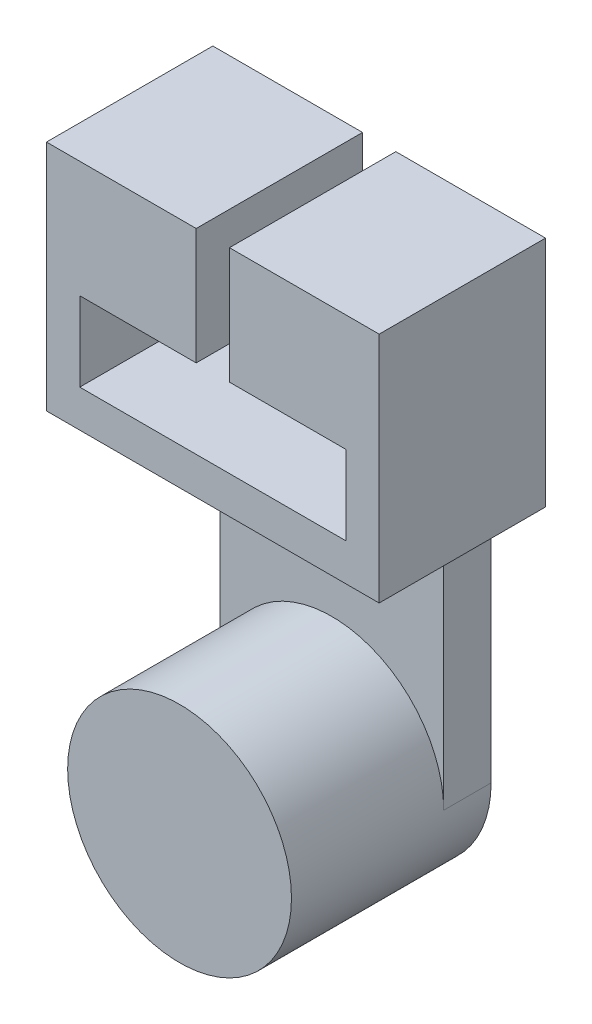
ISO-10303-21;
HEADER;
FILE_DESCRIPTION(('STEP AP214'),'2;1');
FILE_NAME('part.step','',(''),(''),'','','');
FILE_SCHEMA(('AUTOMOTIVE_DESIGN { 1 0 10303 214 1 1 1 1 }'));
ENDSEC;
DATA;
#1=APPLICATION_CONTEXT('core data for automotive mechanical design processes');
#2=APPLICATION_PROTOCOL_DEFINITION('international standard','automotive_design',2000,#1);
#3=PRODUCT_CONTEXT('',#1,'mechanical');
#4=PRODUCT('Part','Part','',(#3));
#5=PRODUCT_RELATED_PRODUCT_CATEGORY('part','',(#4));
#6=PRODUCT_DEFINITION_FORMATION('','',#4);
#7=PRODUCT_DEFINITION_CONTEXT('part definition',#1,'design');
#8=PRODUCT_DEFINITION('design','',#6,#7);
#9=PRODUCT_DEFINITION_SHAPE('','',#8);
#10=(LENGTH_UNIT() NAMED_UNIT(*) SI_UNIT(.MILLI.,.METRE.));
#11=(NAMED_UNIT(*) PLANE_ANGLE_UNIT() SI_UNIT($,.RADIAN.));
#12=(NAMED_UNIT(*) SI_UNIT($,.STERADIAN.) SOLID_ANGLE_UNIT());
#13=UNCERTAINTY_MEASURE_WITH_UNIT(LENGTH_MEASURE(1.E-05),#10,'distance_accuracy_value','');
#14=(GEOMETRIC_REPRESENTATION_CONTEXT(3) GLOBAL_UNCERTAINTY_ASSIGNED_CONTEXT((#13)) GLOBAL_UNIT_ASSIGNED_CONTEXT((#10,
#11,#12)) REPRESENTATION_CONTEXT('',''));
#15=CARTESIAN_POINT('',(0.,0.,0.));
#16=DIRECTION('',(0.,0.,1.));
#17=DIRECTION('',(1.,0.,0.));
#18=AXIS2_PLACEMENT_3D('',#15,#16,#17);
#19=CARTESIAN_POINT('',(12.7,0.,0.));
#20=DIRECTION('',(1.,0.,0.));
#21=DIRECTION('',(0.,0.,-1.));
#22=AXIS2_PLACEMENT_3D('',#19,#20,#21);
#23=PLANE('',#22);
#24=DIRECTION('',(0.,0.,1.));
#25=VECTOR('',#24,1.);
#26=CARTESIAN_POINT('',(12.7,36.5125,15.875));
#27=LINE('',#26,#25);
#28=CARTESIAN_POINT('',(12.7,36.5125,0.));
#29=VERTEX_POINT('',#28);
#30=CARTESIAN_POINT('',(12.7,36.5125,15.875));
#31=VERTEX_POINT('',#30);
#32=EDGE_CURVE('E61',#29,#31,#27,.T.);
#33=ORIENTED_EDGE('',*,*,#32,.F.);
#34=DIRECTION('',(0.,1.,0.));
#35=VECTOR('',#34,1.);
#36=CARTESIAN_POINT('',(12.7,25.4,0.));
#37=LINE('',#36,#35);
#38=CARTESIAN_POINT('',(12.7,28.956,0.));
#39=VERTEX_POINT('',#38);
#40=EDGE_CURVE('E252',#39,#29,#37,.T.);
#41=ORIENTED_EDGE('',*,*,#40,.F.);
#42=DIRECTION('',(0.,0.,-1.));
#43=VECTOR('',#42,1.);
#44=CARTESIAN_POINT('',(12.7,28.956,0.));
#45=LINE('',#44,#43);
#46=CARTESIAN_POINT('',(12.7,28.956,15.875));
#47=VERTEX_POINT('',#46);
#48=EDGE_CURVE('E286',#47,#39,#45,.T.);
#49=ORIENTED_EDGE('',*,*,#48,.F.);
#50=DIRECTION('',(0.,-1.,0.));
#51=VECTOR('',#50,1.);
#52=CARTESIAN_POINT('',(12.7,25.4,15.875));
#53=LINE('',#52,#51);
#54=EDGE_CURVE('E258',#31,#47,#53,.T.);
#55=ORIENTED_EDGE('',*,*,#54,.F.);
#56=EDGE_LOOP('',(#33,#41,#49,#55));
#57=FACE_BOUND('',#56,.T.);
#58=ADVANCED_FACE('F45',(#57),#23,.F.);
#59=CARTESIAN_POINT('',(-12.7,0.,0.));
#60=DIRECTION('',(-1.,0.,0.));
#61=DIRECTION('',(0.,0.,1.));
#62=AXIS2_PLACEMENT_3D('',#59,#60,#61);
#63=PLANE('',#62);
#64=DIRECTION('',(0.,0.,-1.));
#65=VECTOR('',#64,1.);
#66=CARTESIAN_POINT('',(-12.7,36.5125,15.875));
#67=LINE('',#66,#65);
#68=CARTESIAN_POINT('',(-12.7,36.5125,15.875));
#69=VERTEX_POINT('',#68);
#70=CARTESIAN_POINT('',(-12.7,36.5125,0.));
#71=VERTEX_POINT('',#70);
#72=EDGE_CURVE('E202',#69,#71,#67,.T.);
#73=ORIENTED_EDGE('',*,*,#72,.F.);
#74=DIRECTION('',(0.,1.,0.));
#75=VECTOR('',#74,1.);
#76=CARTESIAN_POINT('',(-12.7,25.4,15.875));
#77=LINE('',#76,#75);
#78=CARTESIAN_POINT('',(-12.7,28.956,15.875));
#79=VERTEX_POINT('',#78);
#80=EDGE_CURVE('E224',#79,#69,#77,.T.);
#81=ORIENTED_EDGE('',*,*,#80,.F.);
#82=DIRECTION('',(0.,0.,1.));
#83=VECTOR('',#82,1.);
#84=CARTESIAN_POINT('',(-12.7,28.956,0.));
#85=LINE('',#84,#83);
#86=CARTESIAN_POINT('',(-12.7,28.956,0.));
#87=VERTEX_POINT('',#86);
#88=EDGE_CURVE('E277',#87,#79,#85,.T.);
#89=ORIENTED_EDGE('',*,*,#88,.F.);
#90=DIRECTION('',(0.,-1.,0.));
#91=VECTOR('',#90,1.);
#92=CARTESIAN_POINT('',(-12.7,25.4,0.));
#93=LINE('',#92,#91);
#94=EDGE_CURVE('E230',#71,#87,#93,.T.);
#95=ORIENTED_EDGE('',*,*,#94,.F.);
#96=EDGE_LOOP('',(#73,#81,#89,#95));
#97=FACE_BOUND('',#96,.T.);
#98=ADVANCED_FACE('F363',(#97),#63,.F.);
#99=CARTESIAN_POINT('',(0.,0.,19.05));
#100=DIRECTION('',(0.,0.,-1.));
#101=DIRECTION('',(-1.,0.,0.));
#102=AXIS2_PLACEMENT_3D('',#99,#100,#101);
#103=CYLINDRICAL_SURFACE('',#102,10.6807);
#104=CARTESIAN_POINT('',(0.,0.,4.5212));
#105=DIRECTION('',(0.,0.,1.));
#106=DIRECTION('',(1.,0.,0.));
#107=AXIS2_PLACEMENT_3D('',#104,#105,#106);
#108=CIRCLE('',#107,10.6807);
#109=CARTESIAN_POINT('',(10.6807,0.,4.5212));
#110=VERTEX_POINT('',#109);
#111=CARTESIAN_POINT('',(-10.6807,0.,4.5212));
#112=VERTEX_POINT('',#111);
#113=EDGE_CURVE('E11',#110,#112,#108,.T.);
#114=ORIENTED_EDGE('',*,*,#113,.T.);
#115=DIRECTION('',(0.,0.,-1.));
#116=VECTOR('',#115,1.);
#117=CARTESIAN_POINT('',(-10.6807,0.,4.5212));
#118=LINE('',#117,#116);
#119=CARTESIAN_POINT('',(-10.6807,0.,0.));
#120=VERTEX_POINT('',#119);
#121=EDGE_CURVE('E317',#112,#120,#118,.T.);
#122=ORIENTED_EDGE('',*,*,#121,.T.);
#123=CARTESIAN_POINT('',(0.,0.,0.));
#124=DIRECTION('',(0.,0.,1.));
#125=DIRECTION('',(1.,0.,0.));
#126=AXIS2_PLACEMENT_3D('',#123,#124,#125);
#127=CIRCLE('',#126,10.6807);
#128=CARTESIAN_POINT('',(10.6807,0.,0.));
#129=VERTEX_POINT('',#128);
#130=EDGE_CURVE('E321',#120,#129,#127,.T.);
#131=ORIENTED_EDGE('',*,*,#130,.T.);
#132=DIRECTION('',(0.,0.,-1.));
#133=VECTOR('',#132,1.);
#134=CARTESIAN_POINT('',(10.6807,0.,4.5212));
#135=LINE('',#134,#133);
#136=EDGE_CURVE('E322',#110,#129,#135,.T.);
#137=ORIENTED_EDGE('',*,*,#136,.F.);
#138=EDGE_LOOP('',(#114,#122,#131,#137));
#139=FACE_BOUND('',#138,.T.);
#140=CARTESIAN_POINT('',(0.,0.,19.05));
#141=DIRECTION('',(0.,0.,1.));
#142=DIRECTION('',(1.,0.,0.));
#143=AXIS2_PLACEMENT_3D('',#140,#141,#142);
#144=CIRCLE('',#143,10.6807);
#145=CARTESIAN_POINT('',(10.6807,0.,19.05));
#146=VERTEX_POINT('',#145);
#147=EDGE_CURVE('E54',#146,#146,#144,.T.);
#148=ORIENTED_EDGE('',*,*,#147,.F.);
#149=EDGE_LOOP('',(#148));
#150=FACE_BOUND('',#149,.T.);
#151=ADVANCED_FACE('F47',(#139,#150),#103,.T.);
#152=CARTESIAN_POINT('',(0.,0.,19.05));
#153=DIRECTION('',(0.,0.,1.));
#154=DIRECTION('',(1.,0.,0.));
#155=AXIS2_PLACEMENT_3D('',#152,#153,#154);
#156=PLANE('',#155);
#157=ORIENTED_EDGE('',*,*,#147,.T.);
#158=EDGE_LOOP('',(#157));
#159=FACE_BOUND('',#158,.T.);
#160=ADVANCED_FACE('F463',(#159),#156,.T.);
#161=CARTESIAN_POINT('',(0.,0.,0.));
#162=DIRECTION('',(0.,0.,1.));
#163=DIRECTION('',(1.,0.,0.));
#164=AXIS2_PLACEMENT_3D('',#161,#162,#163);
#165=PLANE('',#164);
#166=ORIENTED_EDGE('',*,*,#130,.F.);
#167=DIRECTION('',(0.,1.,0.));
#168=VECTOR('',#167,1.);
#169=CARTESIAN_POINT('',(-10.6807,0.,0.));
#170=LINE('',#169,#168);
#171=CARTESIAN_POINT('',(-10.6807,25.4,0.));
#172=VERTEX_POINT('',#171);
#173=EDGE_CURVE('E290',#120,#172,#170,.T.);
#174=ORIENTED_EDGE('',*,*,#173,.T.);
#175=DIRECTION('',(-1.,0.,0.));
#176=VECTOR('',#175,1.);
#177=CARTESIAN_POINT('',(0.,25.4,0.));
#178=LINE('',#177,#176);
#179=CARTESIAN_POINT('',(-15.875,25.4,0.));
#180=VERTEX_POINT('',#179);
#181=EDGE_CURVE('E293',#172,#180,#178,.T.);
#182=ORIENTED_EDGE('',*,*,#181,.T.);
#183=DIRECTION('',(0.,-1.,0.));
#184=VECTOR('',#183,1.);
#185=CARTESIAN_POINT('',(-15.875,25.4,0.));
#186=LINE('',#185,#184);
#187=CARTESIAN_POINT('',(-15.875,47.625,0.));
#188=VERTEX_POINT('',#187);
#189=EDGE_CURVE('E233',#188,#180,#186,.T.);
#190=ORIENTED_EDGE('',*,*,#189,.F.);
#191=DIRECTION('',(1.,0.,0.));
#192=VECTOR('',#191,1.);
#193=CARTESIAN_POINT('',(-15.875,47.625,0.));
#194=LINE('',#193,#192);
#195=CARTESIAN_POINT('',(-1.5875,47.625,0.));
#196=VERTEX_POINT('',#195);
#197=EDGE_CURVE('E241',#188,#196,#194,.T.);
#198=ORIENTED_EDGE('',*,*,#197,.T.);
#199=DIRECTION('',(0.,1.,0.));
#200=VECTOR('',#199,1.);
#201=CARTESIAN_POINT('',(-1.5875,36.5125,0.));
#202=LINE('',#201,#200);
#203=CARTESIAN_POINT('',(-1.5875,36.5125,0.));
#204=VERTEX_POINT('',#203);
#205=EDGE_CURVE('E213',#204,#196,#202,.T.);
#206=ORIENTED_EDGE('',*,*,#205,.F.);
#207=DIRECTION('',(-1.,0.,0.));
#208=VECTOR('',#207,1.);
#209=CARTESIAN_POINT('',(-1.5875,36.5125,0.));
#210=LINE('',#209,#208);
#211=EDGE_CURVE('E69',#204,#71,#210,.T.);
#212=ORIENTED_EDGE('',*,*,#211,.T.);
#213=ORIENTED_EDGE('',*,*,#94,.T.);
#214=DIRECTION('',(-1.,0.,0.));
#215=VECTOR('',#214,1.);
#216=CARTESIAN_POINT('',(0.,28.956,0.));
#217=LINE('',#216,#215);
#218=EDGE_CURVE('E273',#39,#87,#217,.T.);
#219=ORIENTED_EDGE('',*,*,#218,.F.);
#220=ORIENTED_EDGE('',*,*,#40,.T.);
#221=DIRECTION('',(1.,0.,0.));
#222=VECTOR('',#221,1.);
#223=CARTESIAN_POINT('',(1.5875,36.5125,0.));
#224=LINE('',#223,#222);
#225=CARTESIAN_POINT('',(1.5875,36.5125,0.));
#226=VERTEX_POINT('',#225);
#227=EDGE_CURVE('E198',#226,#29,#224,.T.);
#228=ORIENTED_EDGE('',*,*,#227,.F.);
#229=DIRECTION('',(0.,-1.,0.));
#230=VECTOR('',#229,1.);
#231=CARTESIAN_POINT('',(1.5875,36.5125,0.));
#232=LINE('',#231,#230);
#233=CARTESIAN_POINT('',(1.5875,47.625,0.));
#234=VERTEX_POINT('',#233);
#235=EDGE_CURVE('E180',#234,#226,#232,.T.);
#236=ORIENTED_EDGE('',*,*,#235,.F.);
#237=DIRECTION('',(-1.,0.,0.));
#238=VECTOR('',#237,1.);
#239=CARTESIAN_POINT('',(15.875,47.625,0.));
#240=LINE('',#239,#238);
#241=CARTESIAN_POINT('',(15.875,47.625,0.));
#242=VERTEX_POINT('',#241);
#243=EDGE_CURVE('E170',#242,#234,#240,.T.);
#244=ORIENTED_EDGE('',*,*,#243,.F.);
#245=DIRECTION('',(0.,1.,0.));
#246=VECTOR('',#245,1.);
#247=CARTESIAN_POINT('',(15.875,25.4,0.));
#248=LINE('',#247,#246);
#249=CARTESIAN_POINT('',(15.875,25.4,0.));
#250=VERTEX_POINT('',#249);
#251=EDGE_CURVE('E253',#250,#242,#248,.T.);
#252=ORIENTED_EDGE('',*,*,#251,.F.);
#253=CARTESIAN_POINT('',(10.6807,25.4,0.));
#254=VERTEX_POINT('',#253);
#255=EDGE_CURVE('E278',#250,#254,#178,.T.);
#256=ORIENTED_EDGE('',*,*,#255,.T.);
#257=DIRECTION('',(0.,-1.,0.));
#258=VECTOR('',#257,1.);
#259=CARTESIAN_POINT('',(10.6807,0.,0.));
#260=LINE('',#259,#258);
#261=EDGE_CURVE('E302',#254,#129,#260,.T.);
#262=ORIENTED_EDGE('',*,*,#261,.T.);
#263=EDGE_LOOP('',(#166,#174,#182,#190,#198,#206,#212,#213,#219,#220,#228,#236,#244,#252,#256,#262));
#264=FACE_BOUND('',#263,.T.);
#265=ADVANCED_FACE('F343',(#264),#165,.F.);
#266=CARTESIAN_POINT('',(-10.6807,0.,4.5212));
#267=DIRECTION('',(-1.,0.,0.));
#268=DIRECTION('',(0.,0.,1.));
#269=AXIS2_PLACEMENT_3D('',#266,#267,#268);
#270=PLANE('',#269);
#271=ORIENTED_EDGE('',*,*,#173,.F.);
#272=ORIENTED_EDGE('',*,*,#121,.F.);
#273=DIRECTION('',(0.,1.,0.));
#274=VECTOR('',#273,1.);
#275=CARTESIAN_POINT('',(-10.6807,0.,4.5212));
#276=LINE('',#275,#274);
#277=CARTESIAN_POINT('',(-10.6807,25.4,4.5212));
#278=VERTEX_POINT('',#277);
#279=EDGE_CURVE('E297',#112,#278,#276,.T.);
#280=ORIENTED_EDGE('',*,*,#279,.T.);
#281=DIRECTION('',(0.,0.,-1.));
#282=VECTOR('',#281,1.);
#283=CARTESIAN_POINT('',(-10.6807,25.4,4.5212));
#284=LINE('',#283,#282);
#285=EDGE_CURVE('E310',#278,#172,#284,.T.);
#286=ORIENTED_EDGE('',*,*,#285,.T.);
#287=EDGE_LOOP('',(#271,#272,#280,#286));
#288=FACE_BOUND('',#287,.T.);
#289=ADVANCED_FACE('F384',(#288),#270,.T.);
#290=CARTESIAN_POINT('',(10.6807,0.,4.5212));
#291=DIRECTION('',(1.,0.,0.));
#292=DIRECTION('',(0.,0.,-1.));
#293=AXIS2_PLACEMENT_3D('',#290,#291,#292);
#294=PLANE('',#293);
#295=ORIENTED_EDGE('',*,*,#261,.F.);
#296=DIRECTION('',(0.,0.,-1.));
#297=VECTOR('',#296,1.);
#298=CARTESIAN_POINT('',(10.6807,25.4,4.5212));
#299=LINE('',#298,#297);
#300=CARTESIAN_POINT('',(10.6807,25.4,4.5212));
#301=VERTEX_POINT('',#300);
#302=EDGE_CURVE('E326',#301,#254,#299,.T.);
#303=ORIENTED_EDGE('',*,*,#302,.F.);
#304=DIRECTION('',(0.,-1.,0.));
#305=VECTOR('',#304,1.);
#306=CARTESIAN_POINT('',(10.6807,0.,4.5212));
#307=LINE('',#306,#305);
#308=EDGE_CURVE('E306',#301,#110,#307,.T.);
#309=ORIENTED_EDGE('',*,*,#308,.T.);
#310=ORIENTED_EDGE('',*,*,#136,.T.);
#311=EDGE_LOOP('',(#295,#303,#309,#310));
#312=FACE_BOUND('',#311,.T.);
#313=ADVANCED_FACE('F341',(#312),#294,.T.);
#314=CARTESIAN_POINT('',(0.,0.,4.5212));
#315=DIRECTION('',(0.,0.,1.));
#316=DIRECTION('',(1.,0.,0.));
#317=AXIS2_PLACEMENT_3D('',#314,#315,#316);
#318=PLANE('',#317);
#319=ORIENTED_EDGE('',*,*,#113,.F.);
#320=ORIENTED_EDGE('',*,*,#308,.F.);
#321=DIRECTION('',(1.,0.,0.));
#322=VECTOR('',#321,1.);
#323=CARTESIAN_POINT('',(10.6807,25.4,4.5212));
#324=LINE('',#323,#322);
#325=EDGE_CURVE('E301',#278,#301,#324,.T.);
#326=ORIENTED_EDGE('',*,*,#325,.F.);
#327=ORIENTED_EDGE('',*,*,#279,.F.);
#328=EDGE_LOOP('',(#319,#320,#326,#327));
#329=FACE_BOUND('',#328,.T.);
#330=ADVANCED_FACE('F387',(#329),#318,.T.);
#331=CARTESIAN_POINT('',(-12.7,28.956,15.875));
#332=DIRECTION('',(0.,0.,-1.));
#333=DIRECTION('',(-1.,0.,0.));
#334=AXIS2_PLACEMENT_3D('',#331,#332,#333);
#335=PLANE('',#334);
#336=DIRECTION('',(1.,0.,0.));
#337=VECTOR('',#336,1.);
#338=CARTESIAN_POINT('',(-12.7,25.4,15.875));
#339=LINE('',#338,#337);
#340=CARTESIAN_POINT('',(-15.875,25.4,15.875));
#341=VERTEX_POINT('',#340);
#342=CARTESIAN_POINT('',(15.875,25.4,15.875));
#343=VERTEX_POINT('',#342);
#344=EDGE_CURVE('E272',#341,#343,#339,.T.);
#345=ORIENTED_EDGE('',*,*,#344,.T.);
#346=DIRECTION('',(0.,-1.,0.));
#347=VECTOR('',#346,1.);
#348=CARTESIAN_POINT('',(15.875,25.4,15.875));
#349=LINE('',#348,#347);
#350=CARTESIAN_POINT('',(15.875,47.625,15.875));
#351=VERTEX_POINT('',#350);
#352=EDGE_CURVE('E167',#351,#343,#349,.T.);
#353=ORIENTED_EDGE('',*,*,#352,.F.);
#354=DIRECTION('',(-1.,0.,0.));
#355=VECTOR('',#354,1.);
#356=CARTESIAN_POINT('',(15.875,47.625,15.875));
#357=LINE('',#356,#355);
#358=CARTESIAN_POINT('',(1.5875,47.625,15.875));
#359=VERTEX_POINT('',#358);
#360=EDGE_CURVE('E160',#351,#359,#357,.T.);
#361=ORIENTED_EDGE('',*,*,#360,.T.);
#362=DIRECTION('',(0.,1.,0.));
#363=VECTOR('',#362,1.);
#364=CARTESIAN_POINT('',(1.5875,36.5125,15.875));
#365=LINE('',#364,#363);
#366=CARTESIAN_POINT('',(1.5875,36.5125,15.875));
#367=VERTEX_POINT('',#366);
#368=EDGE_CURVE('E165',#367,#359,#365,.T.);
#369=ORIENTED_EDGE('',*,*,#368,.F.);
#370=DIRECTION('',(1.,0.,0.));
#371=VECTOR('',#370,1.);
#372=CARTESIAN_POINT('',(1.5875,36.5125,15.875));
#373=LINE('',#372,#371);
#374=EDGE_CURVE('E194',#367,#31,#373,.T.);
#375=ORIENTED_EDGE('',*,*,#374,.T.);
#376=ORIENTED_EDGE('',*,*,#54,.T.);
#377=DIRECTION('',(1.,0.,0.));
#378=VECTOR('',#377,1.);
#379=CARTESIAN_POINT('',(-12.7,28.956,15.875));
#380=LINE('',#379,#378);
#381=EDGE_CURVE('E282',#79,#47,#380,.T.);
#382=ORIENTED_EDGE('',*,*,#381,.F.);
#383=ORIENTED_EDGE('',*,*,#80,.T.);
#384=DIRECTION('',(-1.,0.,0.));
#385=VECTOR('',#384,1.);
#386=CARTESIAN_POINT('',(-1.5875,36.5125,15.875));
#387=LINE('',#386,#385);
#388=CARTESIAN_POINT('',(-1.5875,36.5125,15.875));
#389=VERTEX_POINT('',#388);
#390=EDGE_CURVE('E221',#389,#69,#387,.T.);
#391=ORIENTED_EDGE('',*,*,#390,.F.);
#392=DIRECTION('',(0.,-1.,0.));
#393=VECTOR('',#392,1.);
#394=CARTESIAN_POINT('',(-1.5875,47.625,15.875));
#395=LINE('',#394,#393);
#396=CARTESIAN_POINT('',(-1.5875,47.625,15.875));
#397=VERTEX_POINT('',#396);
#398=EDGE_CURVE('E207',#397,#389,#395,.T.);
#399=ORIENTED_EDGE('',*,*,#398,.F.);
#400=DIRECTION('',(1.,0.,0.));
#401=VECTOR('',#400,1.);
#402=CARTESIAN_POINT('',(-15.875,47.625,15.875));
#403=LINE('',#402,#401);
#404=CARTESIAN_POINT('',(-15.875,47.625,15.875));
#405=VERTEX_POINT('',#404);
#406=EDGE_CURVE('E249',#405,#397,#403,.T.);
#407=ORIENTED_EDGE('',*,*,#406,.F.);
#408=DIRECTION('',(0.,1.,0.));
#409=VECTOR('',#408,1.);
#410=CARTESIAN_POINT('',(-15.875,25.4,15.875));
#411=LINE('',#410,#409);
#412=EDGE_CURVE('E225',#341,#405,#411,.T.);
#413=ORIENTED_EDGE('',*,*,#412,.F.);
#414=EDGE_LOOP('',(#345,#353,#361,#369,#375,#376,#382,#383,#391,#399,#407,#413));
#415=FACE_BOUND('',#414,.T.);
#416=ADVANCED_FACE('F162',(#415),#335,.F.);
#417=CARTESIAN_POINT('',(0.,28.956,0.));
#418=DIRECTION('',(0.,1.,0.));
#419=DIRECTION('',(0.,0.,1.));
#420=AXIS2_PLACEMENT_3D('',#417,#418,#419);
#421=PLANE('',#420);
#422=ORIENTED_EDGE('',*,*,#218,.T.);
#423=ORIENTED_EDGE('',*,*,#88,.T.);
#424=ORIENTED_EDGE('',*,*,#381,.T.);
#425=ORIENTED_EDGE('',*,*,#48,.T.);
#426=EDGE_LOOP('',(#422,#423,#424,#425));
#427=FACE_BOUND('',#426,.T.);
#428=ADVANCED_FACE('F358',(#427),#421,.T.);
#429=CARTESIAN_POINT('',(0.,25.4,0.));
#430=DIRECTION('',(0.,1.,0.));
#431=DIRECTION('',(0.,0.,1.));
#432=AXIS2_PLACEMENT_3D('',#429,#430,#431);
#433=PLANE('',#432);
#434=ORIENTED_EDGE('',*,*,#285,.F.);
#435=ORIENTED_EDGE('',*,*,#325,.T.);
#436=ORIENTED_EDGE('',*,*,#302,.T.);
#437=ORIENTED_EDGE('',*,*,#255,.F.);
#438=DIRECTION('',(0.,0.,-1.));
#439=VECTOR('',#438,1.);
#440=CARTESIAN_POINT('',(15.875,25.4,0.));
#441=LINE('',#440,#439);
#442=EDGE_CURVE('E171',#343,#250,#441,.T.);
#443=ORIENTED_EDGE('',*,*,#442,.F.);
#444=ORIENTED_EDGE('',*,*,#344,.F.);
#445=DIRECTION('',(0.,0.,1.));
#446=VECTOR('',#445,1.);
#447=CARTESIAN_POINT('',(-15.875,25.4,15.875));
#448=LINE('',#447,#446);
#449=EDGE_CURVE('E237',#180,#341,#448,.T.);
#450=ORIENTED_EDGE('',*,*,#449,.F.);
#451=ORIENTED_EDGE('',*,*,#181,.F.);
#452=EDGE_LOOP('',(#434,#435,#436,#437,#443,#444,#450,#451));
#453=FACE_BOUND('',#452,.T.);
#454=ADVANCED_FACE('F348',(#453),#433,.F.);
#455=CARTESIAN_POINT('',(15.875,47.625,0.));
#456=DIRECTION('',(0.,-1.,0.));
#457=DIRECTION('',(0.,0.,-1.));
#458=AXIS2_PLACEMENT_3D('',#455,#456,#457);
#459=PLANE('',#458);
#460=ORIENTED_EDGE('',*,*,#243,.T.);
#461=DIRECTION('',(0.,0.,-1.));
#462=VECTOR('',#461,1.);
#463=CARTESIAN_POINT('',(1.5875,47.625,15.875));
#464=LINE('',#463,#462);
#465=EDGE_CURVE('E174',#359,#234,#464,.T.);
#466=ORIENTED_EDGE('',*,*,#465,.F.);
#467=ORIENTED_EDGE('',*,*,#360,.F.);
#468=DIRECTION('',(0.,0.,1.));
#469=VECTOR('',#468,1.);
#470=CARTESIAN_POINT('',(15.875,47.625,0.));
#471=LINE('',#470,#469);
#472=EDGE_CURVE('E257',#242,#351,#471,.T.);
#473=ORIENTED_EDGE('',*,*,#472,.F.);
#474=EDGE_LOOP('',(#460,#466,#467,#473));
#475=FACE_BOUND('',#474,.T.);
#476=ADVANCED_FACE('F175',(#475),#459,.F.);
#477=CARTESIAN_POINT('',(15.875,0.,0.));
#478=DIRECTION('',(1.,0.,0.));
#479=DIRECTION('',(0.,0.,-1.));
#480=AXIS2_PLACEMENT_3D('',#477,#478,#479);
#481=PLANE('',#480);
#482=ORIENTED_EDGE('',*,*,#251,.T.);
#483=ORIENTED_EDGE('',*,*,#472,.T.);
#484=ORIENTED_EDGE('',*,*,#352,.T.);
#485=ORIENTED_EDGE('',*,*,#442,.T.);
#486=EDGE_LOOP('',(#482,#483,#484,#485));
#487=FACE_BOUND('',#486,.T.);
#488=ADVANCED_FACE('F350',(#487),#481,.T.);
#489=CARTESIAN_POINT('',(-15.875,47.625,15.875));
#490=DIRECTION('',(0.,-1.,0.));
#491=DIRECTION('',(0.,0.,-1.));
#492=AXIS2_PLACEMENT_3D('',#489,#490,#491);
#493=PLANE('',#492);
#494=ORIENTED_EDGE('',*,*,#406,.T.);
#495=DIRECTION('',(0.,0.,1.));
#496=VECTOR('',#495,1.);
#497=CARTESIAN_POINT('',(-1.5875,47.625,0.));
#498=LINE('',#497,#496);
#499=EDGE_CURVE('E203',#196,#397,#498,.T.);
#500=ORIENTED_EDGE('',*,*,#499,.F.);
#501=ORIENTED_EDGE('',*,*,#197,.F.);
#502=DIRECTION('',(0.,0.,-1.));
#503=VECTOR('',#502,1.);
#504=CARTESIAN_POINT('',(-15.875,47.625,15.875));
#505=LINE('',#504,#503);
#506=EDGE_CURVE('E229',#405,#188,#505,.T.);
#507=ORIENTED_EDGE('',*,*,#506,.F.);
#508=EDGE_LOOP('',(#494,#500,#501,#507));
#509=FACE_BOUND('',#508,.T.);
#510=ADVANCED_FACE('F375',(#509),#493,.F.);
#511=CARTESIAN_POINT('',(-15.875,0.,0.));
#512=DIRECTION('',(-1.,0.,0.));
#513=DIRECTION('',(0.,0.,1.));
#514=AXIS2_PLACEMENT_3D('',#511,#512,#513);
#515=PLANE('',#514);
#516=ORIENTED_EDGE('',*,*,#412,.T.);
#517=ORIENTED_EDGE('',*,*,#506,.T.);
#518=ORIENTED_EDGE('',*,*,#189,.T.);
#519=ORIENTED_EDGE('',*,*,#449,.T.);
#520=EDGE_LOOP('',(#516,#517,#518,#519));
#521=FACE_BOUND('',#520,.T.);
#522=ADVANCED_FACE('F379',(#521),#515,.T.);
#523=CARTESIAN_POINT('',(-1.5875,36.5125,15.875));
#524=DIRECTION('',(0.,1.,0.));
#525=DIRECTION('',(0.,0.,1.));
#526=AXIS2_PLACEMENT_3D('',#523,#524,#525);
#527=PLANE('',#526);
#528=ORIENTED_EDGE('',*,*,#72,.T.);
#529=ORIENTED_EDGE('',*,*,#211,.F.);
#530=DIRECTION('',(0.,0.,-1.));
#531=VECTOR('',#530,1.);
#532=CARTESIAN_POINT('',(-1.5875,36.5125,15.875));
#533=LINE('',#532,#531);
#534=EDGE_CURVE('E210',#389,#204,#533,.T.);
#535=ORIENTED_EDGE('',*,*,#534,.F.);
#536=ORIENTED_EDGE('',*,*,#390,.T.);
#537=EDGE_LOOP('',(#528,#529,#535,#536));
#538=FACE_BOUND('',#537,.T.);
#539=ADVANCED_FACE('F369',(#538),#527,.F.);
#540=CARTESIAN_POINT('',(-1.5875,0.,0.));
#541=DIRECTION('',(1.,0.,0.));
#542=DIRECTION('',(0.,0.,-1.));
#543=AXIS2_PLACEMENT_3D('',#540,#541,#542);
#544=PLANE('',#543);
#545=ORIENTED_EDGE('',*,*,#499,.T.);
#546=ORIENTED_EDGE('',*,*,#398,.T.);
#547=ORIENTED_EDGE('',*,*,#534,.T.);
#548=ORIENTED_EDGE('',*,*,#205,.T.);
#549=EDGE_LOOP('',(#545,#546,#547,#548));
#550=FACE_BOUND('',#549,.T.);
#551=ADVANCED_FACE('F371',(#550),#544,.T.);
#552=CARTESIAN_POINT('',(1.5875,36.5125,15.875));
#553=DIRECTION('',(0.,1.,0.));
#554=DIRECTION('',(-1.,0.,0.));
#555=AXIS2_PLACEMENT_3D('',#552,#553,#554);
#556=PLANE('',#555);
#557=ORIENTED_EDGE('',*,*,#32,.T.);
#558=ORIENTED_EDGE('',*,*,#374,.F.);
#559=DIRECTION('',(0.,0.,1.));
#560=VECTOR('',#559,1.);
#561=CARTESIAN_POINT('',(1.5875,36.5125,15.875));
#562=LINE('',#561,#560);
#563=EDGE_CURVE('E184',#226,#367,#562,.T.);
#564=ORIENTED_EDGE('',*,*,#563,.F.);
#565=ORIENTED_EDGE('',*,*,#227,.T.);
#566=EDGE_LOOP('',(#557,#558,#564,#565));
#567=FACE_BOUND('',#566,.T.);
#568=ADVANCED_FACE('F354',(#567),#556,.F.);
#569=CARTESIAN_POINT('',(1.5875,0.,0.));
#570=DIRECTION('',(-1.,0.,0.));
#571=DIRECTION('',(0.,0.,1.));
#572=AXIS2_PLACEMENT_3D('',#569,#570,#571);
#573=PLANE('',#572);
#574=ORIENTED_EDGE('',*,*,#368,.T.);
#575=ORIENTED_EDGE('',*,*,#465,.T.);
#576=ORIENTED_EDGE('',*,*,#235,.T.);
#577=ORIENTED_EDGE('',*,*,#563,.T.);
#578=EDGE_LOOP('',(#574,#575,#576,#577));
#579=FACE_BOUND('',#578,.T.);
#580=ADVANCED_FACE('F182',(#579),#573,.T.);
#581=CLOSED_SHELL('',(#58,#98,#151,#160,#265,#289,#313,#330,#416,#428,#454,#476,#488,#510,#522,
#539,#551,#568,#580));
#582=MANIFOLD_SOLID_BREP('B2',#581);
#583=ADVANCED_BREP_SHAPE_REPRESENTATION('',(#18,#582),#14);
#584=SHAPE_DEFINITION_REPRESENTATION(#9,#583);
ENDSEC;
END-ISO-10303-21;
